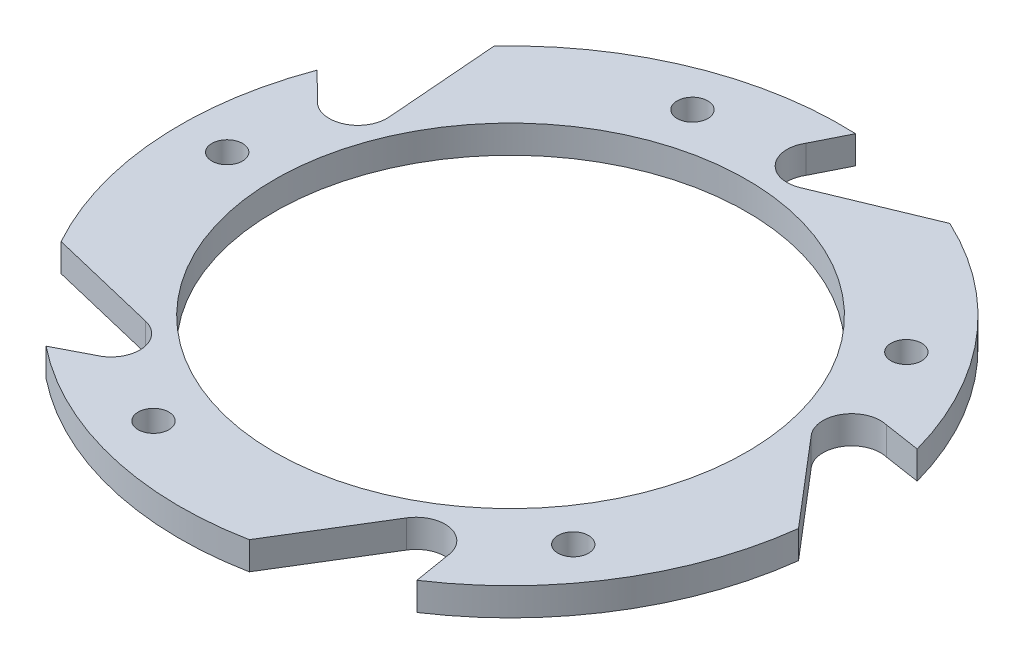
ISO-10303-21;
HEADER;
FILE_DESCRIPTION(('STEP AP214'),'2;1');
FILE_NAME('part.step','',(''),(''),'','','');
FILE_SCHEMA(('AUTOMOTIVE_DESIGN { 1 0 10303 214 1 1 1 1 }'));
ENDSEC;
DATA;
#1=APPLICATION_CONTEXT('core data for automotive mechanical design processes');
#2=APPLICATION_PROTOCOL_DEFINITION('international standard','automotive_design',2000,#1);
#3=PRODUCT_CONTEXT('',#1,'mechanical');
#4=PRODUCT('Part','Part','',(#3));
#5=PRODUCT_RELATED_PRODUCT_CATEGORY('part','',(#4));
#6=PRODUCT_DEFINITION_FORMATION('','',#4);
#7=PRODUCT_DEFINITION_CONTEXT('part definition',#1,'design');
#8=PRODUCT_DEFINITION('design','',#6,#7);
#9=PRODUCT_DEFINITION_SHAPE('','',#8);
#10=(LENGTH_UNIT() NAMED_UNIT(*) SI_UNIT(.MILLI.,.METRE.));
#11=(NAMED_UNIT(*) PLANE_ANGLE_UNIT() SI_UNIT($,.RADIAN.));
#12=(NAMED_UNIT(*) SI_UNIT($,.STERADIAN.) SOLID_ANGLE_UNIT());
#13=UNCERTAINTY_MEASURE_WITH_UNIT(LENGTH_MEASURE(1.E-05),#10,'distance_accuracy_value','');
#14=(GEOMETRIC_REPRESENTATION_CONTEXT(3) GLOBAL_UNCERTAINTY_ASSIGNED_CONTEXT((#13)) GLOBAL_UNIT_ASSIGNED_CONTEXT((#10,
#11,#12)) REPRESENTATION_CONTEXT('',''));
#15=CARTESIAN_POINT('',(0.,0.,0.));
#16=DIRECTION('',(0.,0.,1.));
#17=DIRECTION('',(1.,0.,0.));
#18=AXIS2_PLACEMENT_3D('',#15,#16,#17);
#19=CARTESIAN_POINT('',(-39.6879171864408,6.,46.2708421081998));
#20=DIRECTION('',(0.,-1.,0.));
#21=DIRECTION('',(0.,0.,-1.));
#22=AXIS2_PLACEMENT_3D('',#19,#20,#21);
#23=CYLINDRICAL_SURFACE('',#22,6.18613453942934);
#24=CARTESIAN_POINT('',(-39.6879171864408,0.,46.2708421081998));
#25=DIRECTION('',(0.,1.,0.));
#26=DIRECTION('',(0.,0.,1.));
#27=AXIS2_PLACEMENT_3D('',#24,#25,#26);
#28=CIRCLE('',#27,6.18613453942934);
#29=CARTESIAN_POINT('',(-37.3001585018479,0.,51.9775810197037));
#30=VERTEX_POINT('',#29);
#31=CARTESIAN_POINT('',(-38.2425426728782,0.,40.2559312148061));
#32=VERTEX_POINT('',#31);
#33=EDGE_CURVE('E264',#30,#32,#28,.T.);
#34=ORIENTED_EDGE('',*,*,#33,.F.);
#35=DIRECTION('',(0.,-1.,0.));
#36=VECTOR('',#35,1.);
#37=CARTESIAN_POINT('',(-37.3001585018479,6.,51.9775810197037));
#38=LINE('',#37,#36);
#39=CARTESIAN_POINT('',(-37.3001585018479,6.,51.9775810197037));
#40=VERTEX_POINT('',#39);
#41=EDGE_CURVE('E11',#40,#30,#38,.T.);
#42=ORIENTED_EDGE('',*,*,#41,.F.);
#43=CARTESIAN_POINT('',(-39.6879171864408,6.,46.2708421081998));
#44=DIRECTION('',(0.,1.,0.));
#45=DIRECTION('',(0.,0.,1.));
#46=AXIS2_PLACEMENT_3D('',#43,#44,#45);
#47=CIRCLE('',#46,6.18613453942934);
#48=CARTESIAN_POINT('',(-38.2425426728782,6.,40.2559312148061));
#49=VERTEX_POINT('',#48);
#50=EDGE_CURVE('E216',#40,#49,#47,.T.);
#51=ORIENTED_EDGE('',*,*,#50,.T.);
#52=DIRECTION('',(0.,-1.,0.));
#53=VECTOR('',#52,1.);
#54=CARTESIAN_POINT('',(-38.2425426728782,6.,40.2559312148061));
#55=LINE('',#54,#53);
#56=EDGE_CURVE('E51',#49,#32,#55,.T.);
#57=ORIENTED_EDGE('',*,*,#56,.T.);
#58=EDGE_LOOP('',(#34,#42,#51,#57));
#59=FACE_BOUND('',#58,.T.);
#60=ADVANCED_FACE('F35',(#59),#23,.F.);
#61=CARTESIAN_POINT('',(13.3373435901302,6.,25.770918487058));
#62=DIRECTION('',(0.459628397537717,0.,0.888111330958518));
#63=DIRECTION('',(0.888111330958518,0.,-0.459628397537717));
#64=AXIS2_PLACEMENT_3D('',#61,#62,#63);
#65=PLANE('',#64);
#66=DIRECTION('',(-0.888111330958518,0.,0.459628397537717));
#67=VECTOR('',#66,1.);
#68=CARTESIAN_POINT('',(13.3373435901302,0.,25.770918487058));
#69=LINE('',#68,#67);
#70=CARTESIAN_POINT('',(-44.3285767568688,0.,55.61503108612));
#71=VERTEX_POINT('',#70);
#72=EDGE_CURVE('E266',#30,#71,#69,.T.);
#73=ORIENTED_EDGE('',*,*,#72,.T.);
#74=DIRECTION('',(0.,-1.,0.));
#75=VECTOR('',#74,1.);
#76=CARTESIAN_POINT('',(-44.3285767568688,6.,55.61503108612));
#77=LINE('',#76,#75);
#78=CARTESIAN_POINT('',(-44.3285767568688,6.,55.61503108612));
#79=VERTEX_POINT('',#78);
#80=EDGE_CURVE('E43',#79,#71,#77,.T.);
#81=ORIENTED_EDGE('',*,*,#80,.F.);
#82=DIRECTION('',(-0.888111330958518,0.,0.459628397537717));
#83=VECTOR('',#82,1.);
#84=CARTESIAN_POINT('',(13.3373435901302,6.,25.770918487058));
#85=LINE('',#84,#83);
#86=EDGE_CURVE('E209',#40,#79,#85,.T.);
#87=ORIENTED_EDGE('',*,*,#86,.F.);
#88=ORIENTED_EDGE('',*,*,#41,.T.);
#89=EDGE_LOOP('',(#73,#81,#87,#88));
#90=FACE_BOUND('',#89,.T.);
#91=ADVANCED_FACE('F441',(#90),#65,.F.);
#92=CARTESIAN_POINT('',(0.,6.,0.));
#93=DIRECTION('',(0.,-1.,0.));
#94=DIRECTION('',(0.,0.,-1.));
#95=AXIS2_PLACEMENT_3D('',#92,#93,#94);
#96=CYLINDRICAL_SURFACE('',#95,71.12);
#97=CARTESIAN_POINT('',(0.,0.,0.));
#98=DIRECTION('',(0.,1.,0.));
#99=DIRECTION('',(0.,0.,1.));
#100=AXIS2_PLACEMENT_3D('',#97,#98,#99);
#101=CIRCLE('',#100,71.12);
#102=CARTESIAN_POINT('',(13.5944462221295,0.,69.8086343650501));
#103=VERTEX_POINT('',#102);
#104=EDGE_CURVE('E268',#71,#103,#101,.T.);
#105=ORIENTED_EDGE('',*,*,#104,.T.);
#106=DIRECTION('',(0.,-1.,0.));
#107=VECTOR('',#106,1.);
#108=CARTESIAN_POINT('',(13.5944462221295,6.,69.8086343650501));
#109=LINE('',#108,#107);
#110=CARTESIAN_POINT('',(13.5944462221295,6.,69.8086343650501));
#111=VERTEX_POINT('',#110);
#112=EDGE_CURVE('E359',#111,#103,#109,.T.);
#113=ORIENTED_EDGE('',*,*,#112,.F.);
#114=CARTESIAN_POINT('',(0.,6.,0.));
#115=DIRECTION('',(0.,1.,0.));
#116=DIRECTION('',(0.,0.,1.));
#117=AXIS2_PLACEMENT_3D('',#114,#115,#116);
#118=CIRCLE('',#117,71.12);
#119=EDGE_CURVE('E200',#79,#111,#118,.T.);
#120=ORIENTED_EDGE('',*,*,#119,.F.);
#121=ORIENTED_EDGE('',*,*,#80,.T.);
#122=EDGE_LOOP('',(#105,#113,#120,#121));
#123=FACE_BOUND('',#122,.T.);
#124=ADVANCED_FACE('F364',(#123),#96,.T.);
#125=CARTESIAN_POINT('',(40.9871383780006,6.,25.1286691712854));
#126=DIRECTION('',(0.85253155723572,0.,0.522675754093527));
#127=DIRECTION('',(0.522675754093527,0.,-0.852531557235721));
#128=AXIS2_PLACEMENT_3D('',#125,#126,#127);
#129=PLANE('',#128);
#130=DIRECTION('',(-0.522675754093527,0.,0.852531557235721));
#131=VECTOR('',#130,1.);
#132=CARTESIAN_POINT('',(40.9871383780006,0.,25.1286691712854));
#133=LINE('',#132,#131);
#134=CARTESIAN_POINT('',(26.4680701073451,0.,48.8105862784998));
#135=VERTEX_POINT('',#134);
#136=EDGE_CURVE('E271',#135,#103,#133,.T.);
#137=ORIENTED_EDGE('',*,*,#136,.F.);
#138=DIRECTION('',(0.,-1.,0.));
#139=VECTOR('',#138,1.);
#140=CARTESIAN_POINT('',(26.4680701073451,6.,48.8105862784998));
#141=LINE('',#140,#139);
#142=CARTESIAN_POINT('',(26.4680701073451,6.,48.8105862784998));
#143=VERTEX_POINT('',#142);
#144=EDGE_CURVE('E357',#143,#135,#141,.T.);
#145=ORIENTED_EDGE('',*,*,#144,.F.);
#146=DIRECTION('',(-0.522675754093527,0.,0.852531557235721));
#147=VECTOR('',#146,1.);
#148=CARTESIAN_POINT('',(40.9871383780006,6.,25.1286691712854));
#149=LINE('',#148,#147);
#150=EDGE_CURVE('E208',#143,#111,#149,.T.);
#151=ORIENTED_EDGE('',*,*,#150,.T.);
#152=ORIENTED_EDGE('',*,*,#112,.T.);
#153=EDGE_LOOP('',(#137,#145,#151,#152));
#154=FACE_BOUND('',#153,.T.);
#155=ADVANCED_FACE('F374',(#154),#129,.T.);
#156=CARTESIAN_POINT('',(31.7419450195145,6.,52.0439288138201));
#157=DIRECTION('',(0.,-1.,0.));
#158=DIRECTION('',(0.,0.,-1.));
#159=AXIS2_PLACEMENT_3D('',#156,#157,#158);
#160=CYLINDRICAL_SURFACE('',#159,6.18613453943165);
#161=CARTESIAN_POINT('',(31.7419450195145,0.,52.0439288138201));
#162=DIRECTION('',(0.,1.,0.));
#163=DIRECTION('',(0.,0.,1.));
#164=AXIS2_PLACEMENT_3D('',#161,#162,#163);
#165=CIRCLE('',#164,6.18613453943165);
#166=CARTESIAN_POINT('',(37.907234260101,0.,51.5365146636132));
#167=VERTEX_POINT('',#166);
#168=EDGE_CURVE('E276',#167,#135,#165,.T.);
#169=ORIENTED_EDGE('',*,*,#168,.F.);
#170=DIRECTION('',(0.,-1.,0.));
#171=VECTOR('',#170,1.);
#172=CARTESIAN_POINT('',(37.907234260101,6.,51.5365146636132));
#173=LINE('',#172,#171);
#174=CARTESIAN_POINT('',(37.907234260101,6.,51.5365146636132));
#175=VERTEX_POINT('',#174);
#176=EDGE_CURVE('E355',#175,#167,#173,.T.);
#177=ORIENTED_EDGE('',*,*,#176,.F.);
#178=CARTESIAN_POINT('',(31.7419450195145,6.,52.0439288138201));
#179=DIRECTION('',(0.,1.,0.));
#180=DIRECTION('',(0.,0.,1.));
#181=AXIS2_PLACEMENT_3D('',#178,#179,#180);
#182=CIRCLE('',#181,6.18613453943165);
#183=EDGE_CURVE('E215',#175,#143,#182,.T.);
#184=ORIENTED_EDGE('',*,*,#183,.T.);
#185=ORIENTED_EDGE('',*,*,#144,.T.);
#186=EDGE_LOOP('',(#169,#177,#184,#185));
#187=FACE_BOUND('',#186,.T.);
#188=ADVANCED_FACE('F378',(#187),#160,.F.);
#189=CARTESIAN_POINT('',(28.6310657871985,6.,-4.72091575830874));
#190=DIRECTION('',(0.986677054440139,0.,-0.162691088389409));
#191=DIRECTION('',(-0.162691088389409,0.,-0.986677054440139));
#192=AXIS2_PLACEMENT_3D('',#189,#190,#191);
#193=PLANE('',#192);
#194=DIRECTION('',(0.162691088389409,0.,0.986677054440139));
#195=VECTOR('',#194,1.);
#196=CARTESIAN_POINT('',(28.6310657871985,0.,-4.72091575830874));
#197=LINE('',#196,#195);
#198=CARTESIAN_POINT('',(39.1947541640879,0.,59.3449715310115));
#199=VERTEX_POINT('',#198);
#200=EDGE_CURVE('E279',#167,#199,#197,.T.);
#201=ORIENTED_EDGE('',*,*,#200,.T.);
#202=DIRECTION('',(0.,-1.,0.));
#203=VECTOR('',#202,1.);
#204=CARTESIAN_POINT('',(39.1947541640879,6.,59.3449715310115));
#205=LINE('',#204,#203);
#206=CARTESIAN_POINT('',(39.1947541640879,6.,59.3449715310115));
#207=VERTEX_POINT('',#206);
#208=EDGE_CURVE('E352',#207,#199,#205,.T.);
#209=ORIENTED_EDGE('',*,*,#208,.F.);
#210=DIRECTION('',(0.162691088389409,0.,0.986677054440139));
#211=VECTOR('',#210,1.);
#212=CARTESIAN_POINT('',(28.6310657871985,6.,-4.72091575830874));
#213=LINE('',#212,#211);
#214=EDGE_CURVE('E218',#175,#207,#213,.T.);
#215=ORIENTED_EDGE('',*,*,#214,.F.);
#216=ORIENTED_EDGE('',*,*,#176,.T.);
#217=EDGE_LOOP('',(#201,#209,#215,#216));
#218=FACE_BOUND('',#217,.T.);
#219=ADVANCED_FACE('F383',(#218),#193,.F.);
#220=CARTESIAN_POINT('',(70.5928715183037,0.,8.64296770792669));
#221=VERTEX_POINT('',#220);
#222=EDGE_CURVE('E273',#199,#221,#101,.T.);
#223=ORIENTED_EDGE('',*,*,#222,.T.);
#224=DIRECTION('',(0.,-1.,0.));
#225=VECTOR('',#224,1.);
#226=CARTESIAN_POINT('',(70.5928715183037,6.,8.64296770792669));
#227=LINE('',#226,#225);
#228=CARTESIAN_POINT('',(70.5928715183037,6.,8.64296770792669));
#229=VERTEX_POINT('',#228);
#230=EDGE_CURVE('E350',#229,#221,#227,.T.);
#231=ORIENTED_EDGE('',*,*,#230,.F.);
#232=EDGE_CURVE('E210',#207,#229,#118,.T.);
#233=ORIENTED_EDGE('',*,*,#232,.F.);
#234=ORIENTED_EDGE('',*,*,#208,.T.);
#235=EDGE_LOOP('',(#223,#231,#233,#234));
#236=FACE_BOUND('',#235,.T.);
#237=ADVANCED_FACE('F387',(#236),#96,.T.);
#238=CARTESIAN_POINT('',(36.5645068707778,6.,-31.2158992187372));
#239=DIRECTION('',(0.760540921266908,0.,-0.649290002293646));
#240=DIRECTION('',(-0.649290002293646,0.,-0.760540921266908));
#241=AXIS2_PLACEMENT_3D('',#238,#239,#240);
#242=PLANE('',#241);
#243=DIRECTION('',(0.649290002293646,0.,0.760540921266908));
#244=VECTOR('',#243,1.);
#245=CARTESIAN_POINT('',(36.5645068707778,0.,-31.2158992187372));
#246=LINE('',#245,#244);
#247=CARTESIAN_POINT('',(54.6007096158339,0.,-10.0893298838869));
#248=VERTEX_POINT('',#247);
#249=EDGE_CURVE('E281',#248,#221,#246,.T.);
#250=ORIENTED_EDGE('',*,*,#249,.F.);
#251=DIRECTION('',(0.,-1.,0.));
#252=VECTOR('',#251,1.);
#253=CARTESIAN_POINT('',(54.6007096158339,6.,-10.0893298838869));
#254=LINE('',#253,#252);
#255=CARTESIAN_POINT('',(54.6007096158339,6.,-10.0893298838869));
#256=VERTEX_POINT('',#255);
#257=EDGE_CURVE('E348',#256,#248,#254,.T.);
#258=ORIENTED_EDGE('',*,*,#257,.F.);
#259=DIRECTION('',(0.649290002293646,0.,0.760540921266908));
#260=VECTOR('',#259,1.);
#261=CARTESIAN_POINT('',(36.5645068707778,6.,-31.2158992187372));
#262=LINE('',#261,#260);
#263=EDGE_CURVE('E217',#256,#229,#262,.T.);
#264=ORIENTED_EDGE('',*,*,#263,.T.);
#265=ORIENTED_EDGE('',*,*,#230,.T.);
#266=EDGE_LOOP('',(#250,#258,#264,#265));
#267=FACE_BOUND('',#266,.T.);
#268=ADVANCED_FACE('F390',(#267),#242,.T.);
#269=CARTESIAN_POINT('',(59.3055180775326,6.,-14.1059251931819));
#270=DIRECTION('',(0.,-1.,0.));
#271=DIRECTION('',(0.,0.,-1.));
#272=AXIS2_PLACEMENT_3D('',#269,#270,#271);
#273=CYLINDRICAL_SURFACE('',#272,6.1861345394336);
#274=CARTESIAN_POINT('',(59.3055180775326,0.,-14.1059251931819));
#275=DIRECTION('',(0.,1.,0.));
#276=DIRECTION('',(0.,0.,1.));
#277=AXIS2_PLACEMENT_3D('',#274,#275,#276);
#278=CIRCLE('',#277,6.1861345394336);
#279=CARTESIAN_POINT('',(60.7281176940962,0.,-20.1262632958864));
#280=VERTEX_POINT('',#279);
#281=EDGE_CURVE('E284',#280,#248,#278,.T.);
#282=ORIENTED_EDGE('',*,*,#281,.F.);
#283=DIRECTION('',(0.,-1.,0.));
#284=VECTOR('',#283,1.);
#285=CARTESIAN_POINT('',(60.7281176940962,6.,-20.1262632958864));
#286=LINE('',#285,#284);
#287=CARTESIAN_POINT('',(60.7281176940962,6.,-20.1262632958864));
#288=VERTEX_POINT('',#287);
#289=EDGE_CURVE('E346',#288,#280,#286,.T.);
#290=ORIENTED_EDGE('',*,*,#289,.F.);
#291=CARTESIAN_POINT('',(59.3055180775326,6.,-14.1059251931819));
#292=DIRECTION('',(0.,1.,0.));
#293=DIRECTION('',(0.,0.,1.));
#294=AXIS2_PLACEMENT_3D('',#291,#292,#293);
#295=CIRCLE('',#294,6.1861345394336);
#296=EDGE_CURVE('E223',#288,#256,#295,.T.);
#297=ORIENTED_EDGE('',*,*,#296,.T.);
#298=ORIENTED_EDGE('',*,*,#257,.T.);
#299=EDGE_LOOP('',(#282,#290,#297,#298));
#300=FACE_BOUND('',#299,.T.);
#301=ADVANCED_FACE('F393',(#300),#273,.F.);
#302=CARTESIAN_POINT('',(4.35762820049159,6.,-28.6886048837212));
#303=DIRECTION('',(0.150171558025919,0.,-0.988659953249887));
#304=DIRECTION('',(-0.988659953249887,0.,-0.150171558025919));
#305=AXIS2_PLACEMENT_3D('',#302,#303,#304);
#306=PLANE('',#305);
#307=DIRECTION('',(0.988659953249887,0.,0.150171558025919));
#308=VECTOR('',#307,1.);
#309=CARTESIAN_POINT('',(4.35762820049159,0.,-28.6886048837212));
#310=LINE('',#309,#308);
#311=CARTESIAN_POINT('',(68.552267010973,0.,-18.9378216185629));
#312=VERTEX_POINT('',#311);
#313=EDGE_CURVE('E287',#280,#312,#310,.T.);
#314=ORIENTED_EDGE('',*,*,#313,.T.);
#315=DIRECTION('',(0.,-1.,0.));
#316=VECTOR('',#315,1.);
#317=CARTESIAN_POINT('',(68.552267010973,6.,-18.9378216185629));
#318=LINE('',#317,#316);
#319=CARTESIAN_POINT('',(68.552267010973,6.,-18.9378216185629));
#320=VERTEX_POINT('',#319);
#321=EDGE_CURVE('E343',#320,#312,#318,.T.);
#322=ORIENTED_EDGE('',*,*,#321,.F.);
#323=DIRECTION('',(0.988659953249887,0.,0.150171558025919));
#324=VECTOR('',#323,1.);
#325=CARTESIAN_POINT('',(4.35762820049159,6.,-28.6886048837212));
#326=LINE('',#325,#324);
#327=EDGE_CURVE('E227',#288,#320,#326,.T.);
#328=ORIENTED_EDGE('',*,*,#327,.F.);
#329=ORIENTED_EDGE('',*,*,#289,.T.);
#330=EDGE_LOOP('',(#314,#322,#328,#329));
#331=FACE_BOUND('',#330,.T.);
#332=ADVANCED_FACE('F396',(#331),#306,.F.);
#333=CARTESIAN_POINT('',(30.0343477396381,0.,-64.4669865578866));
#334=VERTEX_POINT('',#333);
#335=EDGE_CURVE('E289',#312,#334,#101,.T.);
#336=ORIENTED_EDGE('',*,*,#335,.T.);
#337=DIRECTION('',(0.,-1.,0.));
#338=VECTOR('',#337,1.);
#339=CARTESIAN_POINT('',(30.0343477396381,6.,-64.4669865578866));
#340=LINE('',#339,#338);
#341=CARTESIAN_POINT('',(30.0343477396381,6.,-64.4669865578866));
#342=VERTEX_POINT('',#341);
#343=EDGE_CURVE('E341',#342,#334,#340,.T.);
#344=ORIENTED_EDGE('',*,*,#343,.F.);
#345=EDGE_CURVE('E207',#320,#342,#118,.T.);
#346=ORIENTED_EDGE('',*,*,#345,.F.);
#347=ORIENTED_EDGE('',*,*,#321,.T.);
#348=EDGE_LOOP('',(#336,#344,#346,#347));
#349=FACE_BOUND('',#348,.T.);
#350=ADVANCED_FACE('F400',(#349),#96,.T.);
#351=CARTESIAN_POINT('',(-18.3890303499827,6.,-44.421155877857));
#352=DIRECTION('',(-0.382491418057614,0.,-0.923959044066497));
#353=DIRECTION('',(-0.923959044066498,0.,0.382491418057614));
#354=AXIS2_PLACEMENT_3D('',#351,#352,#353);
#355=PLANE('',#354);
#356=DIRECTION('',(0.923959044066498,0.,-0.382491418057614));
#357=VECTOR('',#356,1.);
#358=CARTESIAN_POINT('',(-18.3890303499827,0.,-44.421155877857));
#359=LINE('',#358,#357);
#360=CARTESIAN_POINT('',(7.27702424510492,0.,-55.0461350704549));
#361=VERTEX_POINT('',#360);
#362=EDGE_CURVE('E290',#361,#334,#359,.T.);
#363=ORIENTED_EDGE('',*,*,#362,.F.);
#364=DIRECTION('',(0.,-1.,0.));
#365=VECTOR('',#364,1.);
#366=CARTESIAN_POINT('',(7.27702424510492,6.,-55.0461350704549));
#367=LINE('',#366,#365);
#368=CARTESIAN_POINT('',(7.27702424510492,6.,-55.0461350704549));
#369=VERTEX_POINT('',#368);
#370=EDGE_CURVE('E339',#369,#361,#367,.T.);
#371=ORIENTED_EDGE('',*,*,#370,.F.);
#372=DIRECTION('',(0.923959044066498,0.,-0.382491418057614));
#373=VECTOR('',#372,1.);
#374=CARTESIAN_POINT('',(-18.3890303499827,6.,-44.421155877857));
#375=LINE('',#374,#373);
#376=EDGE_CURVE('E226',#369,#342,#375,.T.);
#377=ORIENTED_EDGE('',*,*,#376,.T.);
#378=ORIENTED_EDGE('',*,*,#343,.T.);
#379=EDGE_LOOP('',(#363,#371,#377,#378));
#380=FACE_BOUND('',#379,.T.);
#381=ADVANCED_FACE('F403',(#380),#355,.T.);
#382=CARTESIAN_POINT('',(4.91088087282335,6.,-60.7618700259729));
#383=DIRECTION('',(0.,-1.,0.));
#384=DIRECTION('',(0.,0.,-1.));
#385=AXIS2_PLACEMENT_3D('',#382,#383,#384);
#386=CYLINDRICAL_SURFACE('',#385,6.18613453943233);
#387=CARTESIAN_POINT('',(4.91088087282335,0.,-60.7618700259729));
#388=DIRECTION('',(0.,1.,0.));
#389=DIRECTION('',(0.,0.,1.));
#390=AXIS2_PLACEMENT_3D('',#387,#388,#389);
#391=CIRCLE('',#390,6.18613453943233);
#392=CARTESIAN_POINT('',(-0.375193452344293,0.,-63.9752294470034));
#393=VERTEX_POINT('',#392);
#394=EDGE_CURVE('E293',#393,#361,#391,.T.);
#395=ORIENTED_EDGE('',*,*,#394,.F.);
#396=DIRECTION('',(0.,-1.,0.));
#397=VECTOR('',#396,1.);
#398=CARTESIAN_POINT('',(-0.375193452344293,6.,-63.9752294470034));
#399=LINE('',#398,#397);
#400=CARTESIAN_POINT('',(-0.375193452344293,6.,-63.9752294470034));
#401=VERTEX_POINT('',#400);
#402=EDGE_CURVE('E337',#401,#393,#399,.T.);
#403=ORIENTED_EDGE('',*,*,#402,.F.);
#404=CARTESIAN_POINT('',(4.91088087282335,6.,-60.7618700259729));
#405=DIRECTION('',(0.,1.,0.));
#406=DIRECTION('',(0.,0.,1.));
#407=AXIS2_PLACEMENT_3D('',#404,#405,#406);
#408=CIRCLE('',#407,6.18613453943233);
#409=EDGE_CURVE('E232',#401,#369,#408,.T.);
#410=ORIENTED_EDGE('',*,*,#409,.T.);
#411=ORIENTED_EDGE('',*,*,#370,.T.);
#412=EDGE_LOOP('',(#395,#403,#410,#411));
#413=FACE_BOUND('',#412,.T.);
#414=ADVANCED_FACE('F407',(#413),#386,.F.);
#415=CARTESIAN_POINT('',(-25.9379034489586,6.,-13.009617149646));
#416=DIRECTION('',(-0.893865927436594,0.,-0.448334366034902));
#417=DIRECTION('',(-0.448334366034902,0.,0.893865927436594));
#418=AXIS2_PLACEMENT_3D('',#415,#416,#417);
#419=PLANE('',#418);
#420=DIRECTION('',(0.448334366034902,0.,-0.893865927436594));
#421=VECTOR('',#420,1.);
#422=CARTESIAN_POINT('',(-25.9379034489586,0.,-13.009617149646));
#423=LINE('',#422,#421);
#424=CARTESIAN_POINT('',(3.17287685455299,0.,-71.0491889641689));
#425=VERTEX_POINT('',#424);
#426=EDGE_CURVE('E296',#393,#425,#423,.T.);
#427=ORIENTED_EDGE('',*,*,#426,.T.);
#428=DIRECTION('',(0.,-1.,0.));
#429=VECTOR('',#428,1.);
#430=CARTESIAN_POINT('',(3.17287685455299,6.,-71.0491889641689));
#431=LINE('',#430,#429);
#432=CARTESIAN_POINT('',(3.17287685455299,6.,-71.0491889641689));
#433=VERTEX_POINT('',#432);
#434=EDGE_CURVE('E334',#433,#425,#431,.T.);
#435=ORIENTED_EDGE('',*,*,#434,.F.);
#436=DIRECTION('',(0.448334366034902,0.,-0.893865927436594));
#437=VECTOR('',#436,1.);
#438=CARTESIAN_POINT('',(-25.9379034489586,6.,-13.009617149646));
#439=LINE('',#438,#437);
#440=EDGE_CURVE('E206',#401,#433,#439,.T.);
#441=ORIENTED_EDGE('',*,*,#440,.F.);
#442=ORIENTED_EDGE('',*,*,#402,.T.);
#443=EDGE_LOOP('',(#427,#435,#441,#442));
#444=FACE_BOUND('',#443,.T.);
#445=ADVANCED_FACE('F412',(#444),#419,.F.);
#446=CARTESIAN_POINT('',(-52.0306237852724,0.,-48.4857565529862));
#447=VERTEX_POINT('',#446);
#448=EDGE_CURVE('E298',#425,#447,#101,.T.);
#449=ORIENTED_EDGE('',*,*,#448,.T.);
#450=DIRECTION('',(0.,-1.,0.));
#451=VECTOR('',#450,1.);
#452=CARTESIAN_POINT('',(-52.0306237852724,6.,-48.4857565529862));
#453=LINE('',#452,#451);
#454=CARTESIAN_POINT('',(-52.0306237852724,6.,-48.4857565529862));
#455=VERTEX_POINT('',#454);
#456=EDGE_CURVE('E332',#455,#447,#453,.T.);
#457=ORIENTED_EDGE('',*,*,#456,.F.);
#458=EDGE_CURVE('E199',#433,#455,#118,.T.);
#459=ORIENTED_EDGE('',*,*,#458,.F.);
#460=ORIENTED_EDGE('',*,*,#434,.T.);
#461=EDGE_LOOP('',(#449,#457,#459,#460));
#462=FACE_BOUND('',#461,.T.);
#463=ADVANCED_FACE('F417',(#462),#96,.T.);
#464=CARTESIAN_POINT('',(-47.9295526472172,6.,3.76211506666377));
#465=DIRECTION('',(-0.996933618031658,0.,0.0782519088476884));
#466=DIRECTION('',(0.0782519088476884,0.,0.996933618031659));
#467=AXIS2_PLACEMENT_3D('',#464,#465,#466);
#468=PLANE('',#467);
#469=DIRECTION('',(-0.0782519088476884,0.,-0.996933618031659));
#470=VECTOR('',#469,1.);
#471=CARTESIAN_POINT('',(-47.9295526472172,0.,3.76211506666377));
#472=LINE('',#471,#470);
#473=CARTESIAN_POINT('',(-50.1032612954006,0.,-23.9310525389747));
#474=VERTEX_POINT('',#473);
#475=EDGE_CURVE('E299',#474,#447,#472,.T.);
#476=ORIENTED_EDGE('',*,*,#475,.F.);
#477=DIRECTION('',(0.,-1.,0.));
#478=VECTOR('',#477,1.);
#479=CARTESIAN_POINT('',(-50.1032612954006,6.,-23.9310525389747));
#480=LINE('',#479,#478);
#481=CARTESIAN_POINT('',(-50.1032612954006,6.,-23.9310525389747));
#482=VERTEX_POINT('',#481);
#483=EDGE_CURVE('E330',#482,#474,#480,.T.);
#484=ORIENTED_EDGE('',*,*,#483,.F.);
#485=DIRECTION('',(-0.0782519088476884,0.,-0.996933618031659));
#486=VECTOR('',#485,1.);
#487=CARTESIAN_POINT('',(-47.9295526472172,6.,3.76211506666377));
#488=LINE('',#487,#486);
#489=EDGE_CURVE('E205',#482,#455,#488,.T.);
#490=ORIENTED_EDGE('',*,*,#489,.T.);
#491=ORIENTED_EDGE('',*,*,#456,.T.);
#492=EDGE_LOOP('',(#476,#484,#490,#491));
#493=FACE_BOUND('',#492,.T.);
#494=ADVANCED_FACE('F421',(#493),#468,.T.);
#495=CARTESIAN_POINT('',(-56.2704267834246,6.,-23.4469757028758));
#496=DIRECTION('',(0.,-1.,0.));
#497=DIRECTION('',(0.,0.,-1.));
#498=AXIS2_PLACEMENT_3D('',#495,#496,#497);
#499=CYLINDRICAL_SURFACE('',#498,6.18613453942945);
#500=CARTESIAN_POINT('',(-56.2704267834246,0.,-23.4469757028758));
#501=DIRECTION('',(0.,1.,0.));
#502=DIRECTION('',(0.,0.,1.));
#503=AXIS2_PLACEMENT_3D('',#500,#501,#502);
#504=CIRCLE('',#503,6.18613453942945);
#505=CARTESIAN_POINT('',(-60.96,0.,-19.4126029404378));
#506=VERTEX_POINT('',#505);
#507=EDGE_CURVE('E302',#506,#474,#504,.T.);
#508=ORIENTED_EDGE('',*,*,#507,.F.);
#509=DIRECTION('',(0.,-1.,0.));
#510=VECTOR('',#509,1.);
#511=CARTESIAN_POINT('',(-60.96,6.,-19.4126029404378));
#512=LINE('',#511,#510);
#513=CARTESIAN_POINT('',(-60.96,6.,-19.4126029404378));
#514=VERTEX_POINT('',#513);
#515=EDGE_CURVE('E194',#514,#506,#512,.T.);
#516=ORIENTED_EDGE('',*,*,#515,.F.);
#517=CARTESIAN_POINT('',(-56.2704267834246,6.,-23.4469757028758));
#518=DIRECTION('',(0.,1.,0.));
#519=DIRECTION('',(0.,0.,1.));
#520=AXIS2_PLACEMENT_3D('',#517,#518,#519);
#521=CIRCLE('',#520,6.18613453942945);
#522=EDGE_CURVE('E184',#514,#482,#521,.T.);
#523=ORIENTED_EDGE('',*,*,#522,.T.);
#524=ORIENTED_EDGE('',*,*,#483,.T.);
#525=EDGE_LOOP('',(#508,#516,#523,#524));
#526=FACE_BOUND('',#525,.T.);
#527=ADVANCED_FACE('F424',(#526),#499,.F.);
#528=CARTESIAN_POINT('',(-20.3881341288592,6.,20.6482193046126));
#529=DIRECTION('',(-0.702611082567182,0.,0.71157407671568));
#530=DIRECTION('',(0.71157407671568,0.,0.702611082567182));
#531=AXIS2_PLACEMENT_3D('',#528,#529,#530);
#532=PLANE('',#531);
#533=DIRECTION('',(-0.71157407671568,0.,-0.702611082567182));
#534=VECTOR('',#533,1.);
#535=CARTESIAN_POINT('',(-20.3881341288592,0.,20.6482193046126));
#536=LINE('',#535,#534);
#537=CARTESIAN_POINT('',(-66.59132127274,0.,-24.9729920344104));
#538=VERTEX_POINT('',#537);
#539=EDGE_CURVE('E191',#506,#538,#536,.T.);
#540=ORIENTED_EDGE('',*,*,#539,.T.);
#541=DIRECTION('',(0.,-1.,0.));
#542=VECTOR('',#541,1.);
#543=CARTESIAN_POINT('',(-66.59132127274,6.,-24.9729920344104));
#544=LINE('',#543,#542);
#545=CARTESIAN_POINT('',(-66.59132127274,6.,-24.9729920344104));
#546=VERTEX_POINT('',#545);
#547=EDGE_CURVE('E188',#546,#538,#544,.T.);
#548=ORIENTED_EDGE('',*,*,#547,.F.);
#549=DIRECTION('',(-0.71157407671568,0.,-0.702611082567182));
#550=VECTOR('',#549,1.);
#551=CARTESIAN_POINT('',(-20.3881341288592,6.,20.6482193046126));
#552=LINE('',#551,#550);
#553=EDGE_CURVE('E174',#514,#546,#552,.T.);
#554=ORIENTED_EDGE('',*,*,#553,.F.);
#555=ORIENTED_EDGE('',*,*,#515,.T.);
#556=EDGE_LOOP('',(#540,#548,#554,#555));
#557=FACE_BOUND('',#556,.T.);
#558=ADVANCED_FACE('F189',(#557),#532,.F.);
#559=CARTESIAN_POINT('',(-62.1910416947937,0.,34.5011410378853));
#560=VERTEX_POINT('',#559);
#561=EDGE_CURVE('E272',#538,#560,#101,.T.);
#562=ORIENTED_EDGE('',*,*,#561,.T.);
#563=DIRECTION('',(0.,-1.,0.));
#564=VECTOR('',#563,1.);
#565=CARTESIAN_POINT('',(-62.1910416947937,6.,34.5011410378853));
#566=LINE('',#565,#564);
#567=CARTESIAN_POINT('',(-62.1910416947937,6.,34.5011410378853));
#568=VERTEX_POINT('',#567);
#569=EDGE_CURVE('E113',#568,#560,#566,.T.);
#570=ORIENTED_EDGE('',*,*,#569,.F.);
#571=EDGE_CURVE('E181',#546,#568,#118,.T.);
#572=ORIENTED_EDGE('',*,*,#571,.F.);
#573=ORIENTED_EDGE('',*,*,#547,.T.);
#574=EDGE_LOOP('',(#562,#570,#572,#573));
#575=FACE_BOUND('',#574,.T.);
#576=ADVANCED_FACE('F196',(#575),#96,.T.);
#577=CARTESIAN_POINT('',(49.3176759770968,6.,35.8313889797491));
#578=DIRECTION('',(0.,-1.,0.));
#579=DIRECTION('',(0.,0.,-1.));
#580=AXIS2_PLACEMENT_3D('',#577,#578,#579);
#581=CYLINDRICAL_SURFACE('',#580,3.3);
#582=CARTESIAN_POINT('',(49.3176759770968,6.,35.8313889797491));
#583=DIRECTION('',(0.,1.,0.));
#584=DIRECTION('',(0.,0.,1.));
#585=AXIS2_PLACEMENT_3D('',#582,#583,#584);
#586=CIRCLE('',#585,3.3);
#587=CARTESIAN_POINT('',(49.3176759770968,6.,39.1313889797491));
#588=VERTEX_POINT('',#587);
#589=EDGE_CURVE('E258',#588,#588,#586,.T.);
#590=ORIENTED_EDGE('',*,*,#589,.T.);
#591=EDGE_LOOP('',(#590));
#592=FACE_BOUND('',#591,.T.);
#593=CARTESIAN_POINT('',(49.3176759770968,0.,35.8313889797491));
#594=DIRECTION('',(0.,1.,0.));
#595=DIRECTION('',(0.,0.,1.));
#596=AXIS2_PLACEMENT_3D('',#593,#594,#595);
#597=CIRCLE('',#596,3.3);
#598=CARTESIAN_POINT('',(49.3176759770968,0.,39.1313889797491));
#599=VERTEX_POINT('',#598);
#600=EDGE_CURVE('E321',#599,#599,#597,.T.);
#601=ORIENTED_EDGE('',*,*,#600,.F.);
#602=EDGE_LOOP('',(#601));
#603=FACE_BOUND('',#602,.T.);
#604=ADVANCED_FACE('F473',(#592,#603),#581,.F.);
#605=CARTESIAN_POINT('',(49.3176759770968,6.,-35.8313889797492));
#606=DIRECTION('',(0.,-1.,0.));
#607=DIRECTION('',(0.,0.,-1.));
#608=AXIS2_PLACEMENT_3D('',#605,#606,#607);
#609=CYLINDRICAL_SURFACE('',#608,3.3);
#610=CARTESIAN_POINT('',(49.3176759770968,6.,-35.8313889797492));
#611=DIRECTION('',(0.,1.,0.));
#612=DIRECTION('',(0.,0.,1.));
#613=AXIS2_PLACEMENT_3D('',#610,#611,#612);
#614=CIRCLE('',#613,3.3);
#615=CARTESIAN_POINT('',(49.3176759770968,6.,-32.5313889797492));
#616=VERTEX_POINT('',#615);
#617=EDGE_CURVE('E255',#616,#616,#614,.T.);
#618=ORIENTED_EDGE('',*,*,#617,.T.);
#619=EDGE_LOOP('',(#618));
#620=FACE_BOUND('',#619,.T.);
#621=CARTESIAN_POINT('',(49.3176759770968,0.,-35.8313889797492));
#622=DIRECTION('',(0.,1.,0.));
#623=DIRECTION('',(0.,0.,1.));
#624=AXIS2_PLACEMENT_3D('',#621,#622,#623);
#625=CIRCLE('',#624,3.3);
#626=CARTESIAN_POINT('',(49.3176759770968,0.,-32.5313889797492));
#627=VERTEX_POINT('',#626);
#628=EDGE_CURVE('E318',#627,#627,#625,.T.);
#629=ORIENTED_EDGE('',*,*,#628,.F.);
#630=EDGE_LOOP('',(#629));
#631=FACE_BOUND('',#630,.T.);
#632=ADVANCED_FACE('F477',(#620,#631),#609,.F.);
#633=CARTESIAN_POINT('',(-18.8376759770968,6.,-57.9764052333526));
#634=DIRECTION('',(0.,-1.,0.));
#635=DIRECTION('',(0.,0.,-1.));
#636=AXIS2_PLACEMENT_3D('',#633,#634,#635);
#637=CYLINDRICAL_SURFACE('',#636,3.3);
#638=CARTESIAN_POINT('',(-18.8376759770968,6.,-57.9764052333526));
#639=DIRECTION('',(0.,1.,0.));
#640=DIRECTION('',(0.,0.,1.));
#641=AXIS2_PLACEMENT_3D('',#638,#639,#640);
#642=CIRCLE('',#641,3.3);
#643=CARTESIAN_POINT('',(-18.8376759770968,6.,-54.6764052333526));
#644=VERTEX_POINT('',#643);
#645=EDGE_CURVE('E252',#644,#644,#642,.T.);
#646=ORIENTED_EDGE('',*,*,#645,.T.);
#647=EDGE_LOOP('',(#646));
#648=FACE_BOUND('',#647,.T.);
#649=CARTESIAN_POINT('',(-18.8376759770968,0.,-57.9764052333526));
#650=DIRECTION('',(0.,1.,0.));
#651=DIRECTION('',(0.,0.,1.));
#652=AXIS2_PLACEMENT_3D('',#649,#650,#651);
#653=CIRCLE('',#652,3.3);
#654=CARTESIAN_POINT('',(-18.8376759770968,0.,-54.6764052333526));
#655=VERTEX_POINT('',#654);
#656=EDGE_CURVE('E315',#655,#655,#653,.T.);
#657=ORIENTED_EDGE('',*,*,#656,.F.);
#658=EDGE_LOOP('',(#657));
#659=FACE_BOUND('',#658,.T.);
#660=ADVANCED_FACE('F566',(#648,#659),#637,.F.);
#661=CARTESIAN_POINT('',(-60.96,6.,0.));
#662=DIRECTION('',(0.,-1.,0.));
#663=DIRECTION('',(0.,0.,-1.));
#664=AXIS2_PLACEMENT_3D('',#661,#662,#663);
#665=CYLINDRICAL_SURFACE('',#664,3.3);
#666=CARTESIAN_POINT('',(-60.96,6.,0.));
#667=DIRECTION('',(0.,1.,0.));
#668=DIRECTION('',(0.,0.,1.));
#669=AXIS2_PLACEMENT_3D('',#666,#667,#668);
#670=CIRCLE('',#669,3.3);
#671=CARTESIAN_POINT('',(-60.96,6.,3.3));
#672=VERTEX_POINT('',#671);
#673=EDGE_CURVE('E249',#672,#672,#670,.T.);
#674=ORIENTED_EDGE('',*,*,#673,.T.);
#675=EDGE_LOOP('',(#674));
#676=FACE_BOUND('',#675,.T.);
#677=CARTESIAN_POINT('',(-60.96,0.,0.));
#678=DIRECTION('',(0.,1.,0.));
#679=DIRECTION('',(0.,0.,1.));
#680=AXIS2_PLACEMENT_3D('',#677,#678,#679);
#681=CIRCLE('',#680,3.3);
#682=CARTESIAN_POINT('',(-60.96,0.,3.3));
#683=VERTEX_POINT('',#682);
#684=EDGE_CURVE('E312',#683,#683,#681,.T.);
#685=ORIENTED_EDGE('',*,*,#684,.F.);
#686=EDGE_LOOP('',(#685));
#687=FACE_BOUND('',#686,.T.);
#688=ADVANCED_FACE('F436',(#676,#687),#665,.F.);
#689=CARTESIAN_POINT('',(0.,6.,0.));
#690=DIRECTION('',(0.,-1.,0.));
#691=DIRECTION('',(0.,0.,-1.));
#692=AXIS2_PLACEMENT_3D('',#689,#690,#691);
#693=CYLINDRICAL_SURFACE('',#692,50.8);
#694=CARTESIAN_POINT('',(0.,6.,0.));
#695=DIRECTION('',(0.,1.,0.));
#696=DIRECTION('',(0.,0.,1.));
#697=AXIS2_PLACEMENT_3D('',#694,#695,#696);
#698=CIRCLE('',#697,50.8);
#699=CARTESIAN_POINT('',(0.,6.,50.8));
#700=VERTEX_POINT('',#699);
#701=EDGE_CURVE('E201',#700,#700,#698,.T.);
#702=ORIENTED_EDGE('',*,*,#701,.T.);
#703=EDGE_LOOP('',(#702));
#704=FACE_BOUND('',#703,.T.);
#705=CARTESIAN_POINT('',(0.,0.,0.));
#706=DIRECTION('',(0.,1.,0.));
#707=DIRECTION('',(0.,0.,1.));
#708=AXIS2_PLACEMENT_3D('',#705,#706,#707);
#709=CIRCLE('',#708,50.8);
#710=CARTESIAN_POINT('',(0.,0.,50.8));
#711=VERTEX_POINT('',#710);
#712=EDGE_CURVE('E309',#711,#711,#709,.T.);
#713=ORIENTED_EDGE('',*,*,#712,.F.);
#714=EDGE_LOOP('',(#713));
#715=FACE_BOUND('',#714,.T.);
#716=ADVANCED_FACE('F428',(#704,#715),#693,.F.);
#717=CARTESIAN_POINT('',(-11.2330622515758,6.,46.7462708586396));
#718=DIRECTION('',(-0.233647442413356,0.,0.972321383418928));
#719=DIRECTION('',(0.972321383418928,0.,0.233647442413356));
#720=AXIS2_PLACEMENT_3D('',#717,#718,#719);
#721=PLANE('',#720);
#722=DIRECTION('',(-0.972321383418928,0.,-0.233647442413356));
#723=VECTOR('',#722,1.);
#724=CARTESIAN_POINT('',(-11.2330622515758,0.,46.7462708586396));
#725=LINE('',#724,#723);
#726=EDGE_CURVE('E306',#32,#560,#725,.T.);
#727=ORIENTED_EDGE('',*,*,#726,.F.);
#728=ORIENTED_EDGE('',*,*,#56,.F.);
#729=DIRECTION('',(-0.972321383418928,0.,-0.233647442413356));
#730=VECTOR('',#729,1.);
#731=CARTESIAN_POINT('',(-11.2330622515758,6.,46.7462708586396));
#732=LINE('',#731,#730);
#733=EDGE_CURVE('E197',#49,#568,#732,.T.);
#734=ORIENTED_EDGE('',*,*,#733,.T.);
#735=ORIENTED_EDGE('',*,*,#569,.T.);
#736=EDGE_LOOP('',(#727,#728,#734,#735));
#737=FACE_BOUND('',#736,.T.);
#738=ADVANCED_FACE('F425',(#737),#721,.T.);
#739=CARTESIAN_POINT('',(-18.8376759770968,6.,57.9764052333526));
#740=DIRECTION('',(0.,-1.,0.));
#741=DIRECTION('',(0.,0.,-1.));
#742=AXIS2_PLACEMENT_3D('',#739,#740,#741);
#743=CYLINDRICAL_SURFACE('',#742,3.3);
#744=CARTESIAN_POINT('',(-18.8376759770968,6.,57.9764052333526));
#745=DIRECTION('',(0.,1.,0.));
#746=DIRECTION('',(0.,0.,1.));
#747=AXIS2_PLACEMENT_3D('',#744,#745,#746);
#748=CIRCLE('',#747,3.3);
#749=CARTESIAN_POINT('',(-18.8376759770968,6.,61.2764052333526));
#750=VERTEX_POINT('',#749);
#751=EDGE_CURVE('E261',#750,#750,#748,.T.);
#752=ORIENTED_EDGE('',*,*,#751,.T.);
#753=EDGE_LOOP('',(#752));
#754=FACE_BOUND('',#753,.T.);
#755=CARTESIAN_POINT('',(-18.8376759770968,0.,57.9764052333526));
#756=DIRECTION('',(0.,1.,0.));
#757=DIRECTION('',(0.,0.,1.));
#758=AXIS2_PLACEMENT_3D('',#755,#756,#757);
#759=CIRCLE('',#758,3.3);
#760=CARTESIAN_POINT('',(-18.8376759770968,0.,61.2764052333526));
#761=VERTEX_POINT('',#760);
#762=EDGE_CURVE('E324',#761,#761,#759,.T.);
#763=ORIENTED_EDGE('',*,*,#762,.F.);
#764=EDGE_LOOP('',(#763));
#765=FACE_BOUND('',#764,.T.);
#766=ADVANCED_FACE('F427',(#754,#765),#743,.F.);
#767=CARTESIAN_POINT('',(0.,6.,0.));
#768=DIRECTION('',(0.,1.,0.));
#769=DIRECTION('',(0.,0.,1.));
#770=AXIS2_PLACEMENT_3D('',#767,#768,#769);
#771=PLANE('',#770);
#772=ORIENTED_EDGE('',*,*,#50,.F.);
#773=ORIENTED_EDGE('',*,*,#86,.T.);
#774=ORIENTED_EDGE('',*,*,#119,.T.);
#775=ORIENTED_EDGE('',*,*,#150,.F.);
#776=ORIENTED_EDGE('',*,*,#183,.F.);
#777=ORIENTED_EDGE('',*,*,#214,.T.);
#778=ORIENTED_EDGE('',*,*,#232,.T.);
#779=ORIENTED_EDGE('',*,*,#263,.F.);
#780=ORIENTED_EDGE('',*,*,#296,.F.);
#781=ORIENTED_EDGE('',*,*,#327,.T.);
#782=ORIENTED_EDGE('',*,*,#345,.T.);
#783=ORIENTED_EDGE('',*,*,#376,.F.);
#784=ORIENTED_EDGE('',*,*,#409,.F.);
#785=ORIENTED_EDGE('',*,*,#440,.T.);
#786=ORIENTED_EDGE('',*,*,#458,.T.);
#787=ORIENTED_EDGE('',*,*,#489,.F.);
#788=ORIENTED_EDGE('',*,*,#522,.F.);
#789=ORIENTED_EDGE('',*,*,#553,.T.);
#790=ORIENTED_EDGE('',*,*,#571,.T.);
#791=ORIENTED_EDGE('',*,*,#733,.F.);
#792=EDGE_LOOP('',(#772,#773,#774,#775,#776,#777,#778,#779,#780,#781,#782,#783,#784,#785,#786,
#787,#788,#789,#790,#791));
#793=FACE_BOUND('',#792,.T.);
#794=ORIENTED_EDGE('',*,*,#701,.F.);
#795=EDGE_LOOP('',(#794));
#796=FACE_BOUND('',#795,.T.);
#797=ORIENTED_EDGE('',*,*,#673,.F.);
#798=EDGE_LOOP('',(#797));
#799=FACE_BOUND('',#798,.T.);
#800=ORIENTED_EDGE('',*,*,#645,.F.);
#801=EDGE_LOOP('',(#800));
#802=FACE_BOUND('',#801,.T.);
#803=ORIENTED_EDGE('',*,*,#617,.F.);
#804=EDGE_LOOP('',(#803));
#805=FACE_BOUND('',#804,.T.);
#806=ORIENTED_EDGE('',*,*,#589,.F.);
#807=EDGE_LOOP('',(#806));
#808=FACE_BOUND('',#807,.T.);
#809=ORIENTED_EDGE('',*,*,#751,.F.);
#810=EDGE_LOOP('',(#809));
#811=FACE_BOUND('',#810,.T.);
#812=ADVANCED_FACE('F177',(#793,#796,#799,#802,#805,#808,#811),#771,.T.);
#813=CARTESIAN_POINT('',(0.,0.,0.));
#814=DIRECTION('',(0.,1.,0.));
#815=DIRECTION('',(0.,0.,1.));
#816=AXIS2_PLACEMENT_3D('',#813,#814,#815);
#817=PLANE('',#816);
#818=ORIENTED_EDGE('',*,*,#33,.T.);
#819=ORIENTED_EDGE('',*,*,#726,.T.);
#820=ORIENTED_EDGE('',*,*,#561,.F.);
#821=ORIENTED_EDGE('',*,*,#539,.F.);
#822=ORIENTED_EDGE('',*,*,#507,.T.);
#823=ORIENTED_EDGE('',*,*,#475,.T.);
#824=ORIENTED_EDGE('',*,*,#448,.F.);
#825=ORIENTED_EDGE('',*,*,#426,.F.);
#826=ORIENTED_EDGE('',*,*,#394,.T.);
#827=ORIENTED_EDGE('',*,*,#362,.T.);
#828=ORIENTED_EDGE('',*,*,#335,.F.);
#829=ORIENTED_EDGE('',*,*,#313,.F.);
#830=ORIENTED_EDGE('',*,*,#281,.T.);
#831=ORIENTED_EDGE('',*,*,#249,.T.);
#832=ORIENTED_EDGE('',*,*,#222,.F.);
#833=ORIENTED_EDGE('',*,*,#200,.F.);
#834=ORIENTED_EDGE('',*,*,#168,.T.);
#835=ORIENTED_EDGE('',*,*,#136,.T.);
#836=ORIENTED_EDGE('',*,*,#104,.F.);
#837=ORIENTED_EDGE('',*,*,#72,.F.);
#838=EDGE_LOOP('',(#818,#819,#820,#821,#822,#823,#824,#825,#826,#827,#828,#829,#830,#831,#832,
#833,#834,#835,#836,#837));
#839=FACE_BOUND('',#838,.T.);
#840=ORIENTED_EDGE('',*,*,#712,.T.);
#841=EDGE_LOOP('',(#840));
#842=FACE_BOUND('',#841,.T.);
#843=ORIENTED_EDGE('',*,*,#684,.T.);
#844=EDGE_LOOP('',(#843));
#845=FACE_BOUND('',#844,.T.);
#846=ORIENTED_EDGE('',*,*,#656,.T.);
#847=EDGE_LOOP('',(#846));
#848=FACE_BOUND('',#847,.T.);
#849=ORIENTED_EDGE('',*,*,#628,.T.);
#850=EDGE_LOOP('',(#849));
#851=FACE_BOUND('',#850,.T.);
#852=ORIENTED_EDGE('',*,*,#600,.T.);
#853=EDGE_LOOP('',(#852));
#854=FACE_BOUND('',#853,.T.);
#855=ORIENTED_EDGE('',*,*,#762,.T.);
#856=EDGE_LOOP('',(#855));
#857=FACE_BOUND('',#856,.T.);
#858=ADVANCED_FACE('F368',(#839,#842,#845,#848,#851,#854,#857),#817,.F.);
#859=CLOSED_SHELL('',(#60,#91,#124,#155,#188,#219,#237,#268,#301,#332,#350,#381,#414,#445,#463,
#494,#527,#558,#576,#604,#632,#660,#688,#716,#738,#766,#812,#858));
#860=MANIFOLD_SOLID_BREP('B2',#859);
#861=ADVANCED_BREP_SHAPE_REPRESENTATION('',(#18,#860),#14);
#862=SHAPE_DEFINITION_REPRESENTATION(#9,#861);
ENDSEC;
END-ISO-10303-21;
